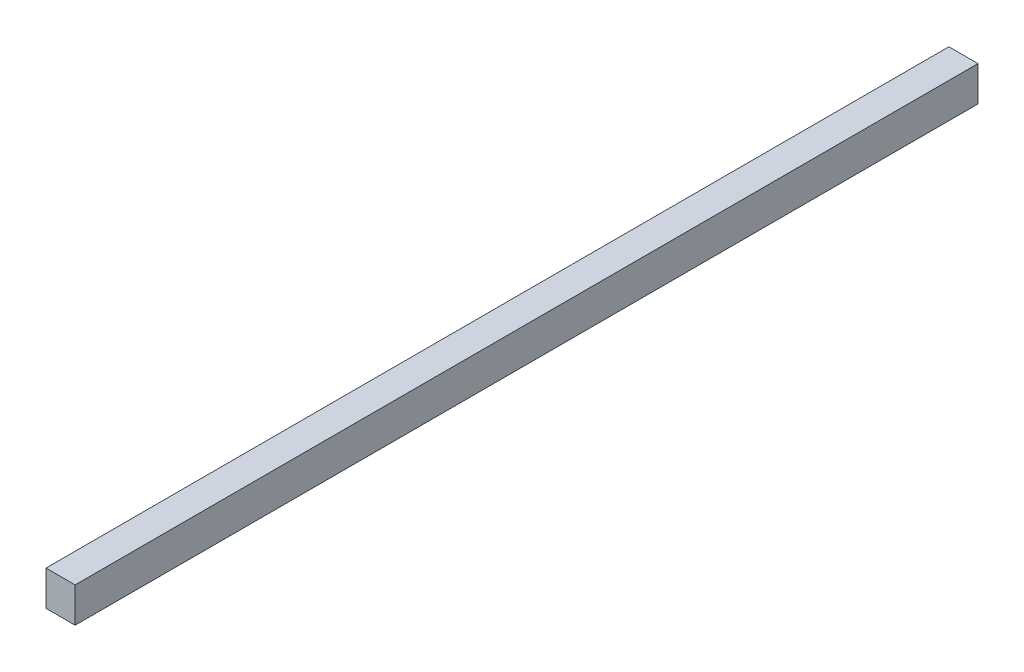
ISO-10303-21;
HEADER;
FILE_DESCRIPTION(('STEP AP214'),'2;1');
FILE_NAME('part.step','',(''),(''),'','','');
FILE_SCHEMA(('AUTOMOTIVE_DESIGN { 1 0 10303 214 1 1 1 1 }'));
ENDSEC;
DATA;
#1=APPLICATION_CONTEXT('core data for automotive mechanical design processes');
#2=APPLICATION_PROTOCOL_DEFINITION('international standard','automotive_design',2000,#1);
#3=PRODUCT_CONTEXT('',#1,'mechanical');
#4=PRODUCT('Part','Part','',(#3));
#5=PRODUCT_RELATED_PRODUCT_CATEGORY('part','',(#4));
#6=PRODUCT_DEFINITION_FORMATION('','',#4);
#7=PRODUCT_DEFINITION_CONTEXT('part definition',#1,'design');
#8=PRODUCT_DEFINITION('design','',#6,#7);
#9=PRODUCT_DEFINITION_SHAPE('','',#8);
#10=(LENGTH_UNIT() NAMED_UNIT(*) SI_UNIT(.MILLI.,.METRE.));
#11=(NAMED_UNIT(*) PLANE_ANGLE_UNIT() SI_UNIT($,.RADIAN.));
#12=(NAMED_UNIT(*) SI_UNIT($,.STERADIAN.) SOLID_ANGLE_UNIT());
#13=UNCERTAINTY_MEASURE_WITH_UNIT(LENGTH_MEASURE(1.E-05),#10,'distance_accuracy_value','');
#14=(GEOMETRIC_REPRESENTATION_CONTEXT(3) GLOBAL_UNCERTAINTY_ASSIGNED_CONTEXT((#13)) GLOBAL_UNIT_ASSIGNED_CONTEXT((#10,
#11,#12)) REPRESENTATION_CONTEXT('',''));
#15=CARTESIAN_POINT('',(0.,0.,0.));
#16=DIRECTION('',(0.,0.,1.));
#17=DIRECTION('',(1.,0.,0.));
#18=AXIS2_PLACEMENT_3D('',#15,#16,#17);
#19=CARTESIAN_POINT('',(7.5,-9.,465.));
#20=DIRECTION('',(-1.,0.,0.));
#21=DIRECTION('',(0.,0.,1.));
#22=AXIS2_PLACEMENT_3D('',#19,#20,#21);
#23=PLANE('',#22);
#24=DIRECTION('',(0.,1.,0.));
#25=VECTOR('',#24,1.);
#26=CARTESIAN_POINT('',(7.5,-9.,0.));
#27=LINE('',#26,#25);
#28=CARTESIAN_POINT('',(7.5,-9.,0.));
#29=VERTEX_POINT('',#28);
#30=CARTESIAN_POINT('',(7.5,9.,0.));
#31=VERTEX_POINT('',#30);
#32=EDGE_CURVE('E99',#29,#31,#27,.T.);
#33=ORIENTED_EDGE('',*,*,#32,.T.);
#34=DIRECTION('',(0.,0.,-1.));
#35=VECTOR('',#34,1.);
#36=CARTESIAN_POINT('',(7.5,9.,465.));
#37=LINE('',#36,#35);
#38=CARTESIAN_POINT('',(7.5,9.,465.));
#39=VERTEX_POINT('',#38);
#40=EDGE_CURVE('E11',#39,#31,#37,.T.);
#41=ORIENTED_EDGE('',*,*,#40,.F.);
#42=DIRECTION('',(0.,1.,0.));
#43=VECTOR('',#42,1.);
#44=CARTESIAN_POINT('',(7.5,-9.,465.));
#45=LINE('',#44,#43);
#46=CARTESIAN_POINT('',(7.5,-9.,465.));
#47=VERTEX_POINT('',#46);
#48=EDGE_CURVE('E87',#47,#39,#45,.T.);
#49=ORIENTED_EDGE('',*,*,#48,.F.);
#50=DIRECTION('',(0.,0.,-1.));
#51=VECTOR('',#50,1.);
#52=CARTESIAN_POINT('',(7.5,-9.,465.));
#53=LINE('',#52,#51);
#54=EDGE_CURVE('E95',#47,#29,#53,.T.);
#55=ORIENTED_EDGE('',*,*,#54,.T.);
#56=EDGE_LOOP('',(#33,#41,#49,#55));
#57=FACE_BOUND('',#56,.T.);
#58=ADVANCED_FACE('F36',(#57),#23,.F.);
#59=CARTESIAN_POINT('',(-7.5,9.,465.));
#60=DIRECTION('',(0.,-1.,0.));
#61=DIRECTION('',(0.,0.,-1.));
#62=AXIS2_PLACEMENT_3D('',#59,#60,#61);
#63=PLANE('',#62);
#64=DIRECTION('',(-1.,0.,0.));
#65=VECTOR('',#64,1.);
#66=CARTESIAN_POINT('',(-7.5,9.,0.));
#67=LINE('',#66,#65);
#68=CARTESIAN_POINT('',(-7.5,9.,0.));
#69=VERTEX_POINT('',#68);
#70=EDGE_CURVE('E91',#31,#69,#67,.T.);
#71=ORIENTED_EDGE('',*,*,#70,.T.);
#72=DIRECTION('',(0.,0.,-1.));
#73=VECTOR('',#72,1.);
#74=CARTESIAN_POINT('',(-7.5,9.,465.));
#75=LINE('',#74,#73);
#76=CARTESIAN_POINT('',(-7.5,9.,465.));
#77=VERTEX_POINT('',#76);
#78=EDGE_CURVE('E44',#77,#69,#75,.T.);
#79=ORIENTED_EDGE('',*,*,#78,.F.);
#80=DIRECTION('',(-1.,0.,0.));
#81=VECTOR('',#80,1.);
#82=CARTESIAN_POINT('',(-7.5,9.,465.));
#83=LINE('',#82,#81);
#84=EDGE_CURVE('E82',#39,#77,#83,.T.);
#85=ORIENTED_EDGE('',*,*,#84,.F.);
#86=ORIENTED_EDGE('',*,*,#40,.T.);
#87=EDGE_LOOP('',(#71,#79,#85,#86));
#88=FACE_BOUND('',#87,.T.);
#89=ADVANCED_FACE('F90',(#88),#63,.F.);
#90=CARTESIAN_POINT('',(-7.5,-9.,465.));
#91=DIRECTION('',(1.,0.,0.));
#92=DIRECTION('',(0.,0.,-1.));
#93=AXIS2_PLACEMENT_3D('',#90,#91,#92);
#94=PLANE('',#93);
#95=DIRECTION('',(0.,-1.,0.));
#96=VECTOR('',#95,1.);
#97=CARTESIAN_POINT('',(-7.5,-9.,0.));
#98=LINE('',#97,#96);
#99=CARTESIAN_POINT('',(-7.5,-9.,0.));
#100=VERTEX_POINT('',#99);
#101=EDGE_CURVE('E69',#69,#100,#98,.T.);
#102=ORIENTED_EDGE('',*,*,#101,.T.);
#103=DIRECTION('',(0.,0.,-1.));
#104=VECTOR('',#103,1.);
#105=CARTESIAN_POINT('',(-7.5,-9.,465.));
#106=LINE('',#105,#104);
#107=CARTESIAN_POINT('',(-7.5,-9.,465.));
#108=VERTEX_POINT('',#107);
#109=EDGE_CURVE('E92',#108,#100,#106,.T.);
#110=ORIENTED_EDGE('',*,*,#109,.F.);
#111=DIRECTION('',(0.,-1.,0.));
#112=VECTOR('',#111,1.);
#113=CARTESIAN_POINT('',(-7.5,-9.,465.));
#114=LINE('',#113,#112);
#115=EDGE_CURVE('E85',#77,#108,#114,.T.);
#116=ORIENTED_EDGE('',*,*,#115,.F.);
#117=ORIENTED_EDGE('',*,*,#78,.T.);
#118=EDGE_LOOP('',(#102,#110,#116,#117));
#119=FACE_BOUND('',#118,.T.);
#120=ADVANCED_FACE('F93',(#119),#94,.F.);
#121=CARTESIAN_POINT('',(-7.5,-9.,465.));
#122=DIRECTION('',(0.,1.,0.));
#123=DIRECTION('',(0.,0.,1.));
#124=AXIS2_PLACEMENT_3D('',#121,#122,#123);
#125=PLANE('',#124);
#126=DIRECTION('',(1.,0.,0.));
#127=VECTOR('',#126,1.);
#128=CARTESIAN_POINT('',(-7.5,-9.,0.));
#129=LINE('',#128,#127);
#130=EDGE_CURVE('E75',#100,#29,#129,.T.);
#131=ORIENTED_EDGE('',*,*,#130,.T.);
#132=ORIENTED_EDGE('',*,*,#54,.F.);
#133=DIRECTION('',(1.,0.,0.));
#134=VECTOR('',#133,1.);
#135=CARTESIAN_POINT('',(-7.5,-9.,465.));
#136=LINE('',#135,#134);
#137=EDGE_CURVE('E52',#108,#47,#136,.T.);
#138=ORIENTED_EDGE('',*,*,#137,.F.);
#139=ORIENTED_EDGE('',*,*,#109,.T.);
#140=EDGE_LOOP('',(#131,#132,#138,#139));
#141=FACE_BOUND('',#140,.T.);
#142=ADVANCED_FACE('F106',(#141),#125,.F.);
#143=CARTESIAN_POINT('',(0.,0.,465.));
#144=DIRECTION('',(0.,0.,-1.));
#145=DIRECTION('',(-1.,0.,0.));
#146=AXIS2_PLACEMENT_3D('',#143,#144,#145);
#147=PLANE('',#146);
#148=ORIENTED_EDGE('',*,*,#48,.T.);
#149=ORIENTED_EDGE('',*,*,#84,.T.);
#150=ORIENTED_EDGE('',*,*,#115,.T.);
#151=ORIENTED_EDGE('',*,*,#137,.T.);
#152=EDGE_LOOP('',(#148,#149,#150,#151));
#153=FACE_BOUND('',#152,.T.);
#154=ADVANCED_FACE('F83',(#153),#147,.F.);
#155=CARTESIAN_POINT('',(0.,0.,0.));
#156=DIRECTION('',(0.,0.,-1.));
#157=DIRECTION('',(-1.,0.,0.));
#158=AXIS2_PLACEMENT_3D('',#155,#156,#157);
#159=PLANE('',#158);
#160=ORIENTED_EDGE('',*,*,#32,.F.);
#161=ORIENTED_EDGE('',*,*,#130,.F.);
#162=ORIENTED_EDGE('',*,*,#101,.F.);
#163=ORIENTED_EDGE('',*,*,#70,.F.);
#164=EDGE_LOOP('',(#160,#161,#162,#163));
#165=FACE_BOUND('',#164,.T.);
#166=ADVANCED_FACE('F109',(#165),#159,.T.);
#167=CLOSED_SHELL('',(#58,#89,#120,#142,#154,#166));
#168=MANIFOLD_SOLID_BREP('B2',#167);
#169=ADVANCED_BREP_SHAPE_REPRESENTATION('',(#18,#168),#14);
#170=SHAPE_DEFINITION_REPRESENTATION(#9,#169);
ENDSEC;
END-ISO-10303-21;
